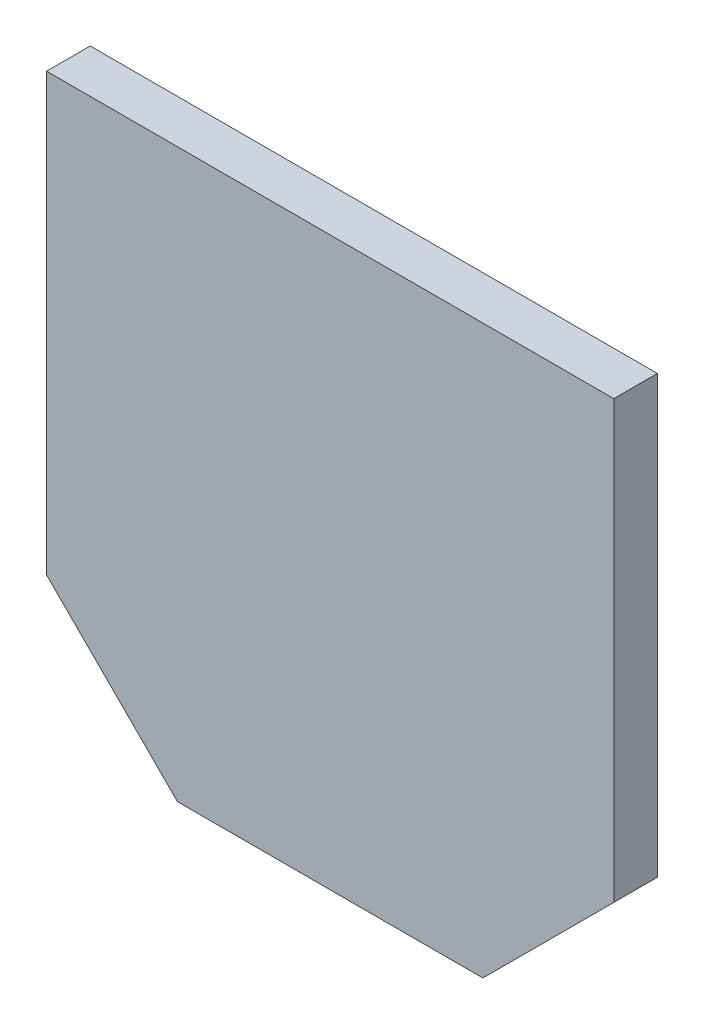
ISO-10303-21;
HEADER;
FILE_DESCRIPTION(('STEP AP214'),'2;1');
FILE_NAME('part.step','',(''),(''),'','','');
FILE_SCHEMA(('AUTOMOTIVE_DESIGN { 1 0 10303 214 1 1 1 1 }'));
ENDSEC;
DATA;
#1=APPLICATION_CONTEXT('core data for automotive mechanical design processes');
#2=APPLICATION_PROTOCOL_DEFINITION('international standard','automotive_design',2000,#1);
#3=PRODUCT_CONTEXT('',#1,'mechanical');
#4=PRODUCT('Part','Part','',(#3));
#5=PRODUCT_RELATED_PRODUCT_CATEGORY('part','',(#4));
#6=PRODUCT_DEFINITION_FORMATION('','',#4);
#7=PRODUCT_DEFINITION_CONTEXT('part definition',#1,'design');
#8=PRODUCT_DEFINITION('design','',#6,#7);
#9=PRODUCT_DEFINITION_SHAPE('','',#8);
#10=(LENGTH_UNIT() NAMED_UNIT(*) SI_UNIT(.MILLI.,.METRE.));
#11=(NAMED_UNIT(*) PLANE_ANGLE_UNIT() SI_UNIT($,.RADIAN.));
#12=(NAMED_UNIT(*) SI_UNIT($,.STERADIAN.) SOLID_ANGLE_UNIT());
#13=UNCERTAINTY_MEASURE_WITH_UNIT(LENGTH_MEASURE(1.E-05),#10,'distance_accuracy_value','');
#14=(GEOMETRIC_REPRESENTATION_CONTEXT(3) GLOBAL_UNCERTAINTY_ASSIGNED_CONTEXT((#13)) GLOBAL_UNIT_ASSIGNED_CONTEXT((#10,
#11,#12)) REPRESENTATION_CONTEXT('',''));
#15=CARTESIAN_POINT('',(0.,0.,0.));
#16=DIRECTION('',(0.,0.,1.));
#17=DIRECTION('',(1.,0.,0.));
#18=AXIS2_PLACEMENT_3D('',#15,#16,#17);
#19=CARTESIAN_POINT('',(130.,0.,10.));
#20=DIRECTION('',(0.,1.,0.));
#21=DIRECTION('',(-1.,0.,0.));
#22=AXIS2_PLACEMENT_3D('',#19,#20,#21);
#23=PLANE('',#22);
#24=DIRECTION('',(1.,0.,0.));
#25=VECTOR('',#24,1.);
#26=CARTESIAN_POINT('',(130.,0.,0.));
#27=LINE('',#26,#25);
#28=CARTESIAN_POINT('',(30.,0.,0.));
#29=VERTEX_POINT('',#28);
#30=CARTESIAN_POINT('',(99.9999999999999,0.,0.));
#31=VERTEX_POINT('',#30);
#32=EDGE_CURVE('E133',#29,#31,#27,.T.);
#33=ORIENTED_EDGE('',*,*,#32,.T.);
#34=DIRECTION('',(0.,0.,1.));
#35=VECTOR('',#34,1.);
#36=CARTESIAN_POINT('',(99.9999999999999,0.,10.));
#37=LINE('',#36,#35);
#38=CARTESIAN_POINT('',(99.9999999999999,0.,10.));
#39=VERTEX_POINT('',#38);
#40=EDGE_CURVE('E67',#31,#39,#37,.T.);
#41=ORIENTED_EDGE('',*,*,#40,.T.);
#42=DIRECTION('',(1.,0.,0.));
#43=VECTOR('',#42,1.);
#44=CARTESIAN_POINT('',(130.,0.,10.));
#45=LINE('',#44,#43);
#46=CARTESIAN_POINT('',(30.,0.,10.));
#47=VERTEX_POINT('',#46);
#48=EDGE_CURVE('E111',#47,#39,#45,.T.);
#49=ORIENTED_EDGE('',*,*,#48,.F.);
#50=DIRECTION('',(0.,0.,-1.));
#51=VECTOR('',#50,1.);
#52=CARTESIAN_POINT('',(30.,0.,10.));
#53=LINE('',#52,#51);
#54=EDGE_CURVE('E154',#47,#29,#53,.T.);
#55=ORIENTED_EDGE('',*,*,#54,.T.);
#56=EDGE_LOOP('',(#33,#41,#49,#55));
#57=FACE_BOUND('',#56,.T.);
#58=ADVANCED_FACE('F44',(#57),#23,.F.);
#59=CARTESIAN_POINT('',(130.,130.,10.));
#60=DIRECTION('',(-1.,0.,0.));
#61=DIRECTION('',(0.,-1.,0.));
#62=AXIS2_PLACEMENT_3D('',#59,#60,#61);
#63=PLANE('',#62);
#64=DIRECTION('',(0.,1.,0.));
#65=VECTOR('',#64,1.);
#66=CARTESIAN_POINT('',(130.,130.,10.));
#67=LINE('',#66,#65);
#68=CARTESIAN_POINT('',(130.,30.,10.));
#69=VERTEX_POINT('',#68);
#70=CARTESIAN_POINT('',(130.,130.,10.));
#71=VERTEX_POINT('',#70);
#72=EDGE_CURVE('E100',#69,#71,#67,.T.);
#73=ORIENTED_EDGE('',*,*,#72,.F.);
#74=DIRECTION('',(0.,0.,-1.));
#75=VECTOR('',#74,1.);
#76=CARTESIAN_POINT('',(130.,30.,10.));
#77=LINE('',#76,#75);
#78=CARTESIAN_POINT('',(130.,30.,0.));
#79=VERTEX_POINT('',#78);
#80=EDGE_CURVE('E121',#69,#79,#77,.T.);
#81=ORIENTED_EDGE('',*,*,#80,.T.);
#82=DIRECTION('',(0.,1.,0.));
#83=VECTOR('',#82,1.);
#84=CARTESIAN_POINT('',(130.,130.,0.));
#85=LINE('',#84,#83);
#86=CARTESIAN_POINT('',(130.,130.,0.));
#87=VERTEX_POINT('',#86);
#88=EDGE_CURVE('E117',#79,#87,#85,.T.);
#89=ORIENTED_EDGE('',*,*,#88,.T.);
#90=DIRECTION('',(0.,0.,-1.));
#91=VECTOR('',#90,1.);
#92=CARTESIAN_POINT('',(130.,130.,10.));
#93=LINE('',#92,#91);
#94=EDGE_CURVE('E114',#71,#87,#93,.T.);
#95=ORIENTED_EDGE('',*,*,#94,.F.);
#96=EDGE_LOOP('',(#73,#81,#89,#95));
#97=FACE_BOUND('',#96,.T.);
#98=ADVANCED_FACE('F115',(#97),#63,.F.);
#99=CARTESIAN_POINT('',(0.,130.,10.));
#100=DIRECTION('',(0.,-1.,0.));
#101=DIRECTION('',(0.,0.,-1.));
#102=AXIS2_PLACEMENT_3D('',#99,#100,#101);
#103=PLANE('',#102);
#104=DIRECTION('',(-1.,0.,0.));
#105=VECTOR('',#104,1.);
#106=CARTESIAN_POINT('',(0.,130.,0.));
#107=LINE('',#106,#105);
#108=CARTESIAN_POINT('',(0.,130.,0.));
#109=VERTEX_POINT('',#108);
#110=EDGE_CURVE('E138',#87,#109,#107,.T.);
#111=ORIENTED_EDGE('',*,*,#110,.T.);
#112=DIRECTION('',(0.,0.,-1.));
#113=VECTOR('',#112,1.);
#114=CARTESIAN_POINT('',(0.,130.,10.));
#115=LINE('',#114,#113);
#116=CARTESIAN_POINT('',(0.,130.,10.));
#117=VERTEX_POINT('',#116);
#118=EDGE_CURVE('E122',#117,#109,#115,.T.);
#119=ORIENTED_EDGE('',*,*,#118,.F.);
#120=DIRECTION('',(-1.,0.,0.));
#121=VECTOR('',#120,1.);
#122=CARTESIAN_POINT('',(0.,130.,10.));
#123=LINE('',#122,#121);
#124=EDGE_CURVE('E104',#71,#117,#123,.T.);
#125=ORIENTED_EDGE('',*,*,#124,.F.);
#126=ORIENTED_EDGE('',*,*,#94,.T.);
#127=EDGE_LOOP('',(#111,#119,#125,#126));
#128=FACE_BOUND('',#127,.T.);
#129=ADVANCED_FACE('F124',(#128),#103,.F.);
#130=CARTESIAN_POINT('',(0.,0.,10.));
#131=DIRECTION('',(1.,0.,0.));
#132=DIRECTION('',(0.,0.,-1.));
#133=AXIS2_PLACEMENT_3D('',#130,#131,#132);
#134=PLANE('',#133);
#135=DIRECTION('',(0.,-1.,0.));
#136=VECTOR('',#135,1.);
#137=CARTESIAN_POINT('',(0.,0.,0.));
#138=LINE('',#137,#136);
#139=CARTESIAN_POINT('',(0.,30.0000000000001,0.));
#140=VERTEX_POINT('',#139);
#141=EDGE_CURVE('E141',#109,#140,#138,.T.);
#142=ORIENTED_EDGE('',*,*,#141,.T.);
#143=DIRECTION('',(0.,0.,1.));
#144=VECTOR('',#143,1.);
#145=CARTESIAN_POINT('',(0.,30.0000000000001,10.));
#146=LINE('',#145,#144);
#147=CARTESIAN_POINT('',(0.,30.0000000000001,10.));
#148=VERTEX_POINT('',#147);
#149=EDGE_CURVE('E11',#140,#148,#146,.T.);
#150=ORIENTED_EDGE('',*,*,#149,.T.);
#151=DIRECTION('',(0.,-1.,0.));
#152=VECTOR('',#151,1.);
#153=CARTESIAN_POINT('',(0.,0.,10.));
#154=LINE('',#153,#152);
#155=EDGE_CURVE('E127',#117,#148,#154,.T.);
#156=ORIENTED_EDGE('',*,*,#155,.F.);
#157=ORIENTED_EDGE('',*,*,#118,.T.);
#158=EDGE_LOOP('',(#142,#150,#156,#157));
#159=FACE_BOUND('',#158,.T.);
#160=ADVANCED_FACE('F171',(#159),#134,.F.);
#161=CARTESIAN_POINT('',(0.,0.,10.));
#162=DIRECTION('',(0.,0.,-1.));
#163=DIRECTION('',(-1.,0.,0.));
#164=AXIS2_PLACEMENT_3D('',#161,#162,#163);
#165=PLANE('',#164);
#166=ORIENTED_EDGE('',*,*,#48,.T.);
#167=DIRECTION('',(-0.707106781186549,-0.707106781186546,0.));
#168=VECTOR('',#167,1.);
#169=CARTESIAN_POINT('',(130.,30.,10.));
#170=LINE('',#169,#168);
#171=EDGE_CURVE('E54',#39,#69,#170,.F.);
#172=ORIENTED_EDGE('',*,*,#171,.T.);
#173=ORIENTED_EDGE('',*,*,#72,.T.);
#174=ORIENTED_EDGE('',*,*,#124,.T.);
#175=ORIENTED_EDGE('',*,*,#155,.T.);
#176=DIRECTION('',(-0.707106781186546,0.707106781186549,0.));
#177=VECTOR('',#176,1.);
#178=CARTESIAN_POINT('',(30.,0.,10.));
#179=LINE('',#178,#177);
#180=EDGE_CURVE('E160',#148,#47,#179,.F.);
#181=ORIENTED_EDGE('',*,*,#180,.T.);
#182=EDGE_LOOP('',(#166,#172,#173,#174,#175,#181));
#183=FACE_BOUND('',#182,.T.);
#184=ADVANCED_FACE('F102',(#183),#165,.F.);
#185=CARTESIAN_POINT('',(0.,0.,0.));
#186=DIRECTION('',(0.,0.,-1.));
#187=DIRECTION('',(-1.,0.,0.));
#188=AXIS2_PLACEMENT_3D('',#185,#186,#187);
#189=PLANE('',#188);
#190=ORIENTED_EDGE('',*,*,#88,.F.);
#191=DIRECTION('',(0.707106781186549,0.707106781186546,0.));
#192=VECTOR('',#191,1.);
#193=CARTESIAN_POINT('',(49.9999999999998,-50.,0.));
#194=LINE('',#193,#192);
#195=EDGE_CURVE('E151',#79,#31,#194,.F.);
#196=ORIENTED_EDGE('',*,*,#195,.T.);
#197=ORIENTED_EDGE('',*,*,#32,.F.);
#198=DIRECTION('',(0.707106781186546,-0.707106781186549,0.));
#199=VECTOR('',#198,1.);
#200=CARTESIAN_POINT('',(15.0000000000001,15.,0.));
#201=LINE('',#200,#199);
#202=EDGE_CURVE('E148',#29,#140,#201,.F.);
#203=ORIENTED_EDGE('',*,*,#202,.T.);
#204=ORIENTED_EDGE('',*,*,#141,.F.);
#205=ORIENTED_EDGE('',*,*,#110,.F.);
#206=EDGE_LOOP('',(#190,#196,#197,#203,#204,#205));
#207=FACE_BOUND('',#206,.T.);
#208=ADVANCED_FACE('F170',(#207),#189,.T.);
#209=CARTESIAN_POINT('',(130.,30.,10.));
#210=DIRECTION('',(-0.707106781186546,0.707106781186549,0.));
#211=DIRECTION('',(0.,0.,-1.));
#212=AXIS2_PLACEMENT_3D('',#209,#210,#211);
#213=PLANE('',#212);
#214=ORIENTED_EDGE('',*,*,#171,.F.);
#215=ORIENTED_EDGE('',*,*,#40,.F.);
#216=ORIENTED_EDGE('',*,*,#195,.F.);
#217=ORIENTED_EDGE('',*,*,#80,.F.);
#218=EDGE_LOOP('',(#214,#215,#216,#217));
#219=FACE_BOUND('',#218,.T.);
#220=ADVANCED_FACE('F189',(#219),#213,.F.);
#221=CARTESIAN_POINT('',(30.,0.,10.));
#222=DIRECTION('',(0.707106781186549,0.707106781186546,0.));
#223=DIRECTION('',(0.,0.,-1.));
#224=AXIS2_PLACEMENT_3D('',#221,#222,#223);
#225=PLANE('',#224);
#226=ORIENTED_EDGE('',*,*,#180,.F.);
#227=ORIENTED_EDGE('',*,*,#149,.F.);
#228=ORIENTED_EDGE('',*,*,#202,.F.);
#229=ORIENTED_EDGE('',*,*,#54,.F.);
#230=EDGE_LOOP('',(#226,#227,#228,#229));
#231=FACE_BOUND('',#230,.T.);
#232=ADVANCED_FACE('F47',(#231),#225,.F.);
#233=CLOSED_SHELL('',(#58,#98,#129,#160,#184,#208,#220,#232));
#234=MANIFOLD_SOLID_BREP('B2',#233);
#235=ADVANCED_BREP_SHAPE_REPRESENTATION('',(#18,#234),#14);
#236=SHAPE_DEFINITION_REPRESENTATION(#9,#235);
ENDSEC;
END-ISO-10303-21;
